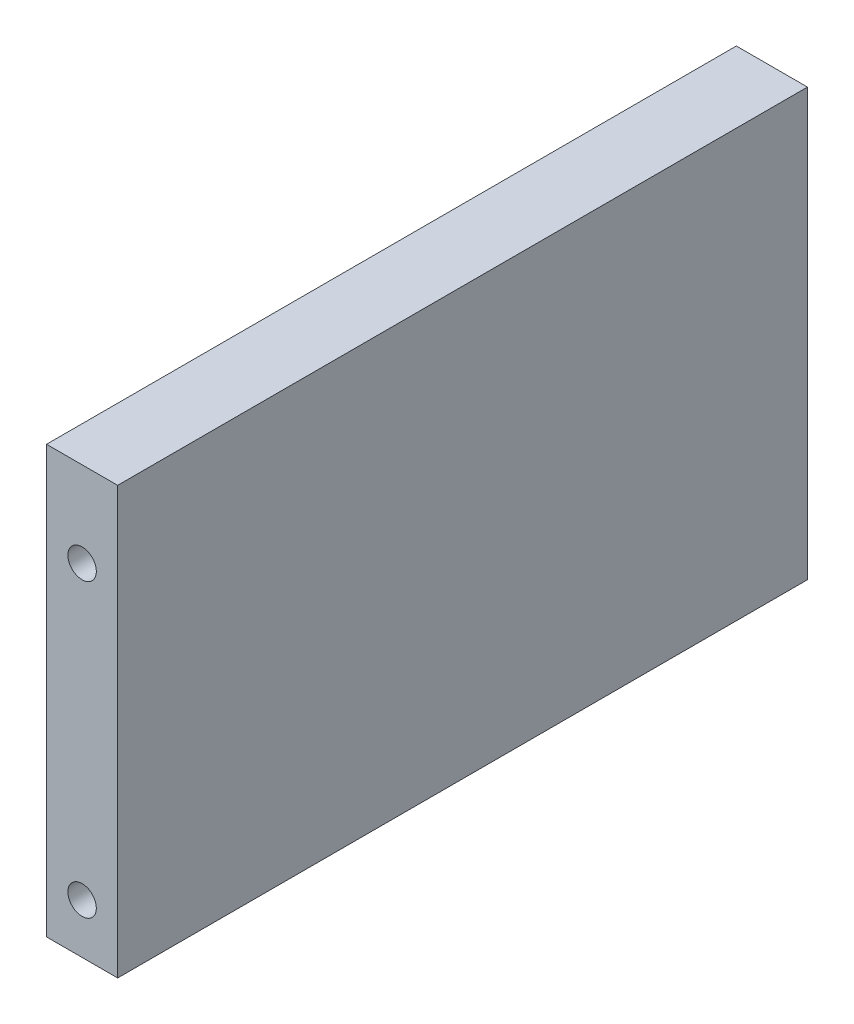
ISO-10303-21;
HEADER;
FILE_DESCRIPTION(('STEP AP214'),'2;1');
FILE_NAME('part.step','',(''),(''),'','','');
FILE_SCHEMA(('AUTOMOTIVE_DESIGN { 1 0 10303 214 1 1 1 1 }'));
ENDSEC;
DATA;
#1=APPLICATION_CONTEXT('core data for automotive mechanical design processes');
#2=APPLICATION_PROTOCOL_DEFINITION('international standard','automotive_design',2000,#1);
#3=PRODUCT_CONTEXT('',#1,'mechanical');
#4=PRODUCT('Part','Part','',(#3));
#5=PRODUCT_RELATED_PRODUCT_CATEGORY('part','',(#4));
#6=PRODUCT_DEFINITION_FORMATION('','',#4);
#7=PRODUCT_DEFINITION_CONTEXT('part definition',#1,'design');
#8=PRODUCT_DEFINITION('design','',#6,#7);
#9=PRODUCT_DEFINITION_SHAPE('','',#8);
#10=(LENGTH_UNIT() NAMED_UNIT(*) SI_UNIT(.MILLI.,.METRE.));
#11=(NAMED_UNIT(*) PLANE_ANGLE_UNIT() SI_UNIT($,.RADIAN.));
#12=(NAMED_UNIT(*) SI_UNIT($,.STERADIAN.) SOLID_ANGLE_UNIT());
#13=UNCERTAINTY_MEASURE_WITH_UNIT(LENGTH_MEASURE(1.E-05),#10,'distance_accuracy_value','');
#14=(GEOMETRIC_REPRESENTATION_CONTEXT(3) GLOBAL_UNCERTAINTY_ASSIGNED_CONTEXT((#13)) GLOBAL_UNIT_ASSIGNED_CONTEXT((#10,
#11,#12)) REPRESENTATION_CONTEXT('',''));
#15=CARTESIAN_POINT('',(0.,0.,0.));
#16=DIRECTION('',(0.,0.,1.));
#17=DIRECTION('',(1.,0.,0.));
#18=AXIS2_PLACEMENT_3D('',#15,#16,#17);
#19=CARTESIAN_POINT('',(5.,7.,10.0014));
#20=DIRECTION('',(0.,0.,1.));
#21=DIRECTION('',(1.,0.,0.));
#22=AXIS2_PLACEMENT_3D('',#19,#20,#21);
#23=PLANE('',#22);
#24=CARTESIAN_POINT('',(5.,7.,10.0014));
#25=DIRECTION('',(0.,0.,1.));
#26=DIRECTION('',(1.,0.,0.));
#27=AXIS2_PLACEMENT_3D('',#24,#25,#26);
#28=CIRCLE('',#27,2.);
#29=CARTESIAN_POINT('',(7.,7.,10.0014));
#30=VERTEX_POINT('',#29);
#31=EDGE_CURVE('E18',#30,#30,#28,.F.);
#32=ORIENTED_EDGE('',*,*,#31,.T.);
#33=EDGE_LOOP('',(#32));
#34=FACE_BOUND('',#33,.T.);
#35=ADVANCED_FACE('F15',(#34),#23,.F.);
#36=CARTESIAN_POINT('',(5.,48.,10.0014));
#37=DIRECTION('',(0.,0.,1.));
#38=DIRECTION('',(1.,0.,0.));
#39=AXIS2_PLACEMENT_3D('',#36,#37,#38);
#40=PLANE('',#39);
#41=CARTESIAN_POINT('',(5.,48.,10.0014));
#42=DIRECTION('',(0.,0.,1.));
#43=DIRECTION('',(1.,0.,0.));
#44=AXIS2_PLACEMENT_3D('',#41,#42,#43);
#45=CIRCLE('',#44,2.);
#46=CARTESIAN_POINT('',(7.,48.,10.0014));
#47=VERTEX_POINT('',#46);
#48=EDGE_CURVE('E95',#47,#47,#45,.F.);
#49=ORIENTED_EDGE('',*,*,#48,.T.);
#50=EDGE_LOOP('',(#49));
#51=FACE_BOUND('',#50,.T.);
#52=ADVANCED_FACE('F223',(#51),#40,.F.);
#53=CARTESIAN_POINT('',(5.,7.,87.0014));
#54=DIRECTION('',(0.,0.,1.));
#55=DIRECTION('',(1.,0.,0.));
#56=AXIS2_PLACEMENT_3D('',#53,#54,#55);
#57=PLANE('',#56);
#58=CARTESIAN_POINT('',(5.,7.,87.0014));
#59=DIRECTION('',(0.,0.,1.));
#60=DIRECTION('',(1.,0.,0.));
#61=AXIS2_PLACEMENT_3D('',#58,#59,#60);
#62=CIRCLE('',#61,2.);
#63=CARTESIAN_POINT('',(7.,7.,87.0014));
#64=VERTEX_POINT('',#63);
#65=EDGE_CURVE('E93',#64,#64,#62,.T.);
#66=ORIENTED_EDGE('',*,*,#65,.T.);
#67=EDGE_LOOP('',(#66));
#68=FACE_BOUND('',#67,.T.);
#69=ADVANCED_FACE('F116',(#68),#57,.T.);
#70=CARTESIAN_POINT('',(5.,48.,87.0014));
#71=DIRECTION('',(0.,0.,1.));
#72=DIRECTION('',(1.,0.,0.));
#73=AXIS2_PLACEMENT_3D('',#70,#71,#72);
#74=PLANE('',#73);
#75=CARTESIAN_POINT('',(5.,48.,87.0014));
#76=DIRECTION('',(0.,0.,1.));
#77=DIRECTION('',(1.,0.,0.));
#78=AXIS2_PLACEMENT_3D('',#75,#76,#77);
#79=CIRCLE('',#78,2.);
#80=CARTESIAN_POINT('',(7.,48.,87.0014));
#81=VERTEX_POINT('',#80);
#82=EDGE_CURVE('E64',#81,#81,#79,.T.);
#83=ORIENTED_EDGE('',*,*,#82,.T.);
#84=EDGE_LOOP('',(#83));
#85=FACE_BOUND('',#84,.T.);
#86=ADVANCED_FACE('F106',(#85),#74,.T.);
#87=CARTESIAN_POINT('',(5.,7.,0.001400000000103));
#88=DIRECTION('',(0.,0.,1.));
#89=DIRECTION('',(1.,0.,0.));
#90=AXIS2_PLACEMENT_3D('',#87,#88,#89);
#91=CYLINDRICAL_SURFACE('',#90,2.);
#92=CARTESIAN_POINT('',(5.,7.,0.001400000000103));
#93=DIRECTION('',(0.,0.,1.));
#94=DIRECTION('',(1.,0.,0.));
#95=AXIS2_PLACEMENT_3D('',#92,#93,#94);
#96=CIRCLE('',#95,2.);
#97=CARTESIAN_POINT('',(7.,7.,0.001400000000103));
#98=VERTEX_POINT('',#97);
#99=EDGE_CURVE('E72',#98,#98,#96,.F.);
#100=ORIENTED_EDGE('',*,*,#99,.T.);
#101=EDGE_LOOP('',(#100));
#102=FACE_BOUND('',#101,.T.);
#103=ORIENTED_EDGE('',*,*,#31,.F.);
#104=EDGE_LOOP('',(#103));
#105=FACE_BOUND('',#104,.T.);
#106=ADVANCED_FACE('F103',(#102,#105),#91,.F.);
#107=CARTESIAN_POINT('',(5.,48.,0.001400000000103));
#108=DIRECTION('',(0.,0.,1.));
#109=DIRECTION('',(1.,0.,0.));
#110=AXIS2_PLACEMENT_3D('',#107,#108,#109);
#111=CYLINDRICAL_SURFACE('',#110,2.);
#112=CARTESIAN_POINT('',(5.,48.,0.001400000000103));
#113=DIRECTION('',(0.,0.,1.));
#114=DIRECTION('',(1.,0.,0.));
#115=AXIS2_PLACEMENT_3D('',#112,#113,#114);
#116=CIRCLE('',#115,2.);
#117=CARTESIAN_POINT('',(7.,48.,0.001400000000103));
#118=VERTEX_POINT('',#117);
#119=EDGE_CURVE('E86',#118,#118,#116,.F.);
#120=ORIENTED_EDGE('',*,*,#119,.T.);
#121=EDGE_LOOP('',(#120));
#122=FACE_BOUND('',#121,.T.);
#123=ORIENTED_EDGE('',*,*,#48,.F.);
#124=EDGE_LOOP('',(#123));
#125=FACE_BOUND('',#124,.T.);
#126=ADVANCED_FACE('F105',(#122,#125),#111,.F.);
#127=CARTESIAN_POINT('',(10.,0.,0.001400000000103));
#128=DIRECTION('',(1.,0.,0.));
#129=DIRECTION('',(0.,0.,-1.));
#130=AXIS2_PLACEMENT_3D('',#127,#128,#129);
#131=PLANE('',#130);
#132=DIRECTION('',(0.,0.,1.));
#133=VECTOR('',#132,1.);
#134=CARTESIAN_POINT('',(10.,60.,0.001400000000103));
#135=LINE('',#134,#133);
#136=CARTESIAN_POINT('',(10.,60.,97.0014));
#137=VERTEX_POINT('',#136);
#138=CARTESIAN_POINT('',(10.,60.,0.001400000000103));
#139=VERTEX_POINT('',#138);
#140=EDGE_CURVE('E248',#137,#139,#135,.F.);
#141=ORIENTED_EDGE('',*,*,#140,.F.);
#142=DIRECTION('',(0.,1.,0.));
#143=VECTOR('',#142,1.);
#144=CARTESIAN_POINT('',(10.,0.,97.0014));
#145=LINE('',#144,#143);
#146=CARTESIAN_POINT('',(10.,0.,97.0014));
#147=VERTEX_POINT('',#146);
#148=EDGE_CURVE('E58',#147,#137,#145,.T.);
#149=ORIENTED_EDGE('',*,*,#148,.F.);
#150=DIRECTION('',(0.,0.,1.));
#151=VECTOR('',#150,1.);
#152=CARTESIAN_POINT('',(10.,0.,0.001400000000103));
#153=LINE('',#152,#151);
#154=CARTESIAN_POINT('',(10.,0.,0.001400000000103));
#155=VERTEX_POINT('',#154);
#156=EDGE_CURVE('E56',#147,#155,#153,.F.);
#157=ORIENTED_EDGE('',*,*,#156,.T.);
#158=DIRECTION('',(0.,1.,0.));
#159=VECTOR('',#158,1.);
#160=CARTESIAN_POINT('',(10.,0.,0.001400000000103));
#161=LINE('',#160,#159);
#162=EDGE_CURVE('E53',#155,#139,#161,.T.);
#163=ORIENTED_EDGE('',*,*,#162,.T.);
#164=EDGE_LOOP('',(#141,#149,#157,#163));
#165=FACE_BOUND('',#164,.T.);
#166=ADVANCED_FACE('F57',(#165),#131,.T.);
#167=CARTESIAN_POINT('',(5.,7.,87.0014));
#168=DIRECTION('',(0.,0.,1.));
#169=DIRECTION('',(1.,0.,0.));
#170=AXIS2_PLACEMENT_3D('',#167,#168,#169);
#171=CYLINDRICAL_SURFACE('',#170,2.);
#172=ORIENTED_EDGE('',*,*,#65,.F.);
#173=EDGE_LOOP('',(#172));
#174=FACE_BOUND('',#173,.T.);
#175=CARTESIAN_POINT('',(5.,7.,97.0014));
#176=DIRECTION('',(0.,0.,1.));
#177=DIRECTION('',(1.,0.,0.));
#178=AXIS2_PLACEMENT_3D('',#175,#176,#177);
#179=CIRCLE('',#178,2.);
#180=CARTESIAN_POINT('',(7.,7.,97.0014));
#181=VERTEX_POINT('',#180);
#182=EDGE_CURVE('E83',#181,#181,#179,.F.);
#183=ORIENTED_EDGE('',*,*,#182,.F.);
#184=EDGE_LOOP('',(#183));
#185=FACE_BOUND('',#184,.T.);
#186=ADVANCED_FACE('F143',(#174,#185),#171,.F.);
#187=CARTESIAN_POINT('',(5.,48.,87.0014));
#188=DIRECTION('',(0.,0.,1.));
#189=DIRECTION('',(1.,0.,0.));
#190=AXIS2_PLACEMENT_3D('',#187,#188,#189);
#191=CYLINDRICAL_SURFACE('',#190,2.);
#192=ORIENTED_EDGE('',*,*,#82,.F.);
#193=EDGE_LOOP('',(#192));
#194=FACE_BOUND('',#193,.T.);
#195=CARTESIAN_POINT('',(5.,48.,97.0014));
#196=DIRECTION('',(0.,0.,1.));
#197=DIRECTION('',(1.,0.,0.));
#198=AXIS2_PLACEMENT_3D('',#195,#196,#197);
#199=CIRCLE('',#198,2.);
#200=CARTESIAN_POINT('',(7.,48.,97.0014));
#201=VERTEX_POINT('',#200);
#202=EDGE_CURVE('E80',#201,#201,#199,.F.);
#203=ORIENTED_EDGE('',*,*,#202,.F.);
#204=EDGE_LOOP('',(#203));
#205=FACE_BOUND('',#204,.T.);
#206=ADVANCED_FACE('F140',(#194,#205),#191,.F.);
#207=CARTESIAN_POINT('',(0.,0.,0.001400000000103));
#208=DIRECTION('',(0.,1.,0.));
#209=DIRECTION('',(0.,0.,1.));
#210=AXIS2_PLACEMENT_3D('',#207,#208,#209);
#211=PLANE('',#210);
#212=DIRECTION('',(1.,0.,0.));
#213=VECTOR('',#212,1.);
#214=CARTESIAN_POINT('',(0.,0.,97.0014));
#215=LINE('',#214,#213);
#216=CARTESIAN_POINT('',(0.,0.,97.0014));
#217=VERTEX_POINT('',#216);
#218=EDGE_CURVE('E246',#217,#147,#215,.T.);
#219=ORIENTED_EDGE('',*,*,#218,.F.);
#220=DIRECTION('',(0.,0.,-1.));
#221=VECTOR('',#220,1.);
#222=CARTESIAN_POINT('',(0.,0.,0.001400000000103));
#223=LINE('',#222,#221);
#224=CARTESIAN_POINT('',(0.,0.,0.001400000000103));
#225=VERTEX_POINT('',#224);
#226=EDGE_CURVE('E76',#217,#225,#223,.T.);
#227=ORIENTED_EDGE('',*,*,#226,.T.);
#228=DIRECTION('',(1.,0.,0.));
#229=VECTOR('',#228,1.);
#230=CARTESIAN_POINT('',(0.,0.,0.001400000000103));
#231=LINE('',#230,#229);
#232=EDGE_CURVE('E63',#225,#155,#231,.T.);
#233=ORIENTED_EDGE('',*,*,#232,.T.);
#234=ORIENTED_EDGE('',*,*,#156,.F.);
#235=EDGE_LOOP('',(#219,#227,#233,#234));
#236=FACE_BOUND('',#235,.T.);
#237=ADVANCED_FACE('F75',(#236),#211,.F.);
#238=CARTESIAN_POINT('',(0.,0.,0.001400000000103));
#239=DIRECTION('',(0.,0.,1.));
#240=DIRECTION('',(1.,0.,0.));
#241=AXIS2_PLACEMENT_3D('',#238,#239,#240);
#242=PLANE('',#241);
#243=ORIENTED_EDGE('',*,*,#119,.F.);
#244=EDGE_LOOP('',(#243));
#245=FACE_BOUND('',#244,.T.);
#246=ORIENTED_EDGE('',*,*,#99,.F.);
#247=EDGE_LOOP('',(#246));
#248=FACE_BOUND('',#247,.T.);
#249=ORIENTED_EDGE('',*,*,#162,.F.);
#250=ORIENTED_EDGE('',*,*,#232,.F.);
#251=DIRECTION('',(0.,1.,0.));
#252=VECTOR('',#251,1.);
#253=CARTESIAN_POINT('',(0.,0.,0.001400000000103));
#254=LINE('',#253,#252);
#255=CARTESIAN_POINT('',(0.,60.,0.001400000000103));
#256=VERTEX_POINT('',#255);
#257=EDGE_CURVE('E255',#225,#256,#254,.T.);
#258=ORIENTED_EDGE('',*,*,#257,.T.);
#259=DIRECTION('',(1.,0.,0.));
#260=VECTOR('',#259,1.);
#261=CARTESIAN_POINT('',(0.,60.,0.001400000000103));
#262=LINE('',#261,#260);
#263=EDGE_CURVE('E71',#139,#256,#262,.F.);
#264=ORIENTED_EDGE('',*,*,#263,.F.);
#265=EDGE_LOOP('',(#249,#250,#258,#264));
#266=FACE_BOUND('',#265,.T.);
#267=ADVANCED_FACE('F68',(#245,#248,#266),#242,.F.);
#268=CARTESIAN_POINT('',(0.,60.,0.001400000000103));
#269=DIRECTION('',(0.,1.,0.));
#270=DIRECTION('',(0.,0.,1.));
#271=AXIS2_PLACEMENT_3D('',#268,#269,#270);
#272=PLANE('',#271);
#273=DIRECTION('',(1.,0.,0.));
#274=VECTOR('',#273,1.);
#275=CARTESIAN_POINT('',(0.,60.,97.0014));
#276=LINE('',#275,#274);
#277=CARTESIAN_POINT('',(0.,60.,97.0014));
#278=VERTEX_POINT('',#277);
#279=EDGE_CURVE('E32',#137,#278,#276,.F.);
#280=ORIENTED_EDGE('',*,*,#279,.F.);
#281=ORIENTED_EDGE('',*,*,#140,.T.);
#282=ORIENTED_EDGE('',*,*,#263,.T.);
#283=DIRECTION('',(0.,0.,-1.));
#284=VECTOR('',#283,1.);
#285=CARTESIAN_POINT('',(0.,60.,0.001400000000103));
#286=LINE('',#285,#284);
#287=EDGE_CURVE('E24',#256,#278,#286,.F.);
#288=ORIENTED_EDGE('',*,*,#287,.T.);
#289=EDGE_LOOP('',(#280,#281,#282,#288));
#290=FACE_BOUND('',#289,.T.);
#291=ADVANCED_FACE('F127',(#290),#272,.T.);
#292=CARTESIAN_POINT('',(0.,0.,97.0014));
#293=DIRECTION('',(0.,0.,1.));
#294=DIRECTION('',(1.,0.,0.));
#295=AXIS2_PLACEMENT_3D('',#292,#293,#294);
#296=PLANE('',#295);
#297=ORIENTED_EDGE('',*,*,#202,.T.);
#298=EDGE_LOOP('',(#297));
#299=FACE_BOUND('',#298,.T.);
#300=ORIENTED_EDGE('',*,*,#182,.T.);
#301=EDGE_LOOP('',(#300));
#302=FACE_BOUND('',#301,.T.);
#303=ORIENTED_EDGE('',*,*,#148,.T.);
#304=ORIENTED_EDGE('',*,*,#279,.T.);
#305=DIRECTION('',(0.,1.,0.));
#306=VECTOR('',#305,1.);
#307=CARTESIAN_POINT('',(0.,0.,97.0014));
#308=LINE('',#307,#306);
#309=EDGE_CURVE('E9',#278,#217,#308,.F.);
#310=ORIENTED_EDGE('',*,*,#309,.T.);
#311=ORIENTED_EDGE('',*,*,#218,.T.);
#312=EDGE_LOOP('',(#303,#304,#310,#311));
#313=FACE_BOUND('',#312,.T.);
#314=ADVANCED_FACE('F121',(#299,#302,#313),#296,.T.);
#315=CARTESIAN_POINT('',(0.,0.,0.001400000000103));
#316=DIRECTION('',(1.,0.,0.));
#317=DIRECTION('',(0.,0.,-1.));
#318=AXIS2_PLACEMENT_3D('',#315,#316,#317);
#319=PLANE('',#318);
#320=ORIENTED_EDGE('',*,*,#287,.F.);
#321=ORIENTED_EDGE('',*,*,#257,.F.);
#322=ORIENTED_EDGE('',*,*,#226,.F.);
#323=ORIENTED_EDGE('',*,*,#309,.F.);
#324=EDGE_LOOP('',(#320,#321,#322,#323));
#325=FACE_BOUND('',#324,.T.);
#326=ADVANCED_FACE('F119',(#325),#319,.F.);
#327=CLOSED_SHELL('',(#35,#52,#69,#86,#106,#126,#166,#186,#206,#237,#267,#291,#314,#326));
#328=MANIFOLD_SOLID_BREP('B1',#327);
#329=ADVANCED_BREP_SHAPE_REPRESENTATION('',(#18,#328),#14);
#330=SHAPE_DEFINITION_REPRESENTATION(#9,#329);
ENDSEC;
END-ISO-10303-21;
